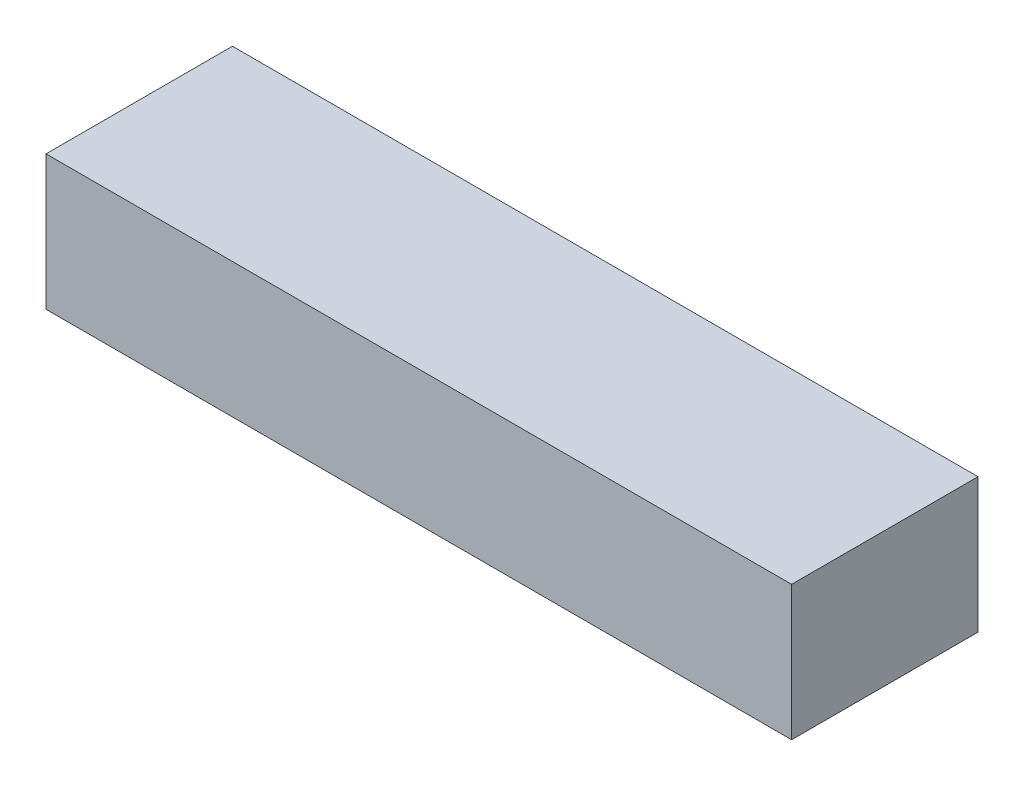
ISO-10303-21;
HEADER;
FILE_DESCRIPTION(('STEP AP214'),'2;1');
FILE_NAME('part.step','',(''),(''),'','','');
FILE_SCHEMA(('AUTOMOTIVE_DESIGN { 1 0 10303 214 1 1 1 1 }'));
ENDSEC;
DATA;
#1=APPLICATION_CONTEXT('core data for automotive mechanical design processes');
#2=APPLICATION_PROTOCOL_DEFINITION('international standard','automotive_design',2000,#1);
#3=PRODUCT_CONTEXT('',#1,'mechanical');
#4=PRODUCT('Part','Part','',(#3));
#5=PRODUCT_RELATED_PRODUCT_CATEGORY('part','',(#4));
#6=PRODUCT_DEFINITION_FORMATION('','',#4);
#7=PRODUCT_DEFINITION_CONTEXT('part definition',#1,'design');
#8=PRODUCT_DEFINITION('design','',#6,#7);
#9=PRODUCT_DEFINITION_SHAPE('','',#8);
#10=(LENGTH_UNIT() NAMED_UNIT(*) SI_UNIT(.MILLI.,.METRE.));
#11=(NAMED_UNIT(*) PLANE_ANGLE_UNIT() SI_UNIT($,.RADIAN.));
#12=(NAMED_UNIT(*) SI_UNIT($,.STERADIAN.) SOLID_ANGLE_UNIT());
#13=UNCERTAINTY_MEASURE_WITH_UNIT(LENGTH_MEASURE(1.E-05),#10,'distance_accuracy_value','');
#14=(GEOMETRIC_REPRESENTATION_CONTEXT(3) GLOBAL_UNCERTAINTY_ASSIGNED_CONTEXT((#13)) GLOBAL_UNIT_ASSIGNED_CONTEXT((#10,
#11,#12)) REPRESENTATION_CONTEXT('',''));
#15=CARTESIAN_POINT('',(0.,0.,0.));
#16=DIRECTION('',(0.,0.,1.));
#17=DIRECTION('',(1.,0.,0.));
#18=AXIS2_PLACEMENT_3D('',#15,#16,#17);
#19=CARTESIAN_POINT('',(54.,19.5,13.5));
#20=DIRECTION('',(-1.,0.,0.));
#21=DIRECTION('',(0.,0.,1.));
#22=AXIS2_PLACEMENT_3D('',#19,#20,#21);
#23=PLANE('',#22);
#24=DIRECTION('',(0.,0.,-1.));
#25=VECTOR('',#24,1.);
#26=CARTESIAN_POINT('',(54.,0.,13.5));
#27=LINE('',#26,#25);
#28=CARTESIAN_POINT('',(54.,0.,13.5));
#29=VERTEX_POINT('',#28);
#30=CARTESIAN_POINT('',(54.,0.,-13.5));
#31=VERTEX_POINT('',#30);
#32=EDGE_CURVE('E101',#29,#31,#27,.T.);
#33=ORIENTED_EDGE('',*,*,#32,.T.);
#34=DIRECTION('',(0.,-1.,0.));
#35=VECTOR('',#34,1.);
#36=CARTESIAN_POINT('',(54.,19.5,-13.5));
#37=LINE('',#36,#35);
#38=CARTESIAN_POINT('',(54.,19.5,-13.5));
#39=VERTEX_POINT('',#38);
#40=EDGE_CURVE('E11',#39,#31,#37,.T.);
#41=ORIENTED_EDGE('',*,*,#40,.F.);
#42=DIRECTION('',(0.,0.,-1.));
#43=VECTOR('',#42,1.);
#44=CARTESIAN_POINT('',(54.,19.5,13.5));
#45=LINE('',#44,#43);
#46=CARTESIAN_POINT('',(54.,19.5,13.5));
#47=VERTEX_POINT('',#46);
#48=EDGE_CURVE('E89',#47,#39,#45,.T.);
#49=ORIENTED_EDGE('',*,*,#48,.F.);
#50=DIRECTION('',(0.,-1.,0.));
#51=VECTOR('',#50,1.);
#52=CARTESIAN_POINT('',(54.,19.5,13.5));
#53=LINE('',#52,#51);
#54=EDGE_CURVE('E97',#47,#29,#53,.T.);
#55=ORIENTED_EDGE('',*,*,#54,.T.);
#56=EDGE_LOOP('',(#33,#41,#49,#55));
#57=FACE_BOUND('',#56,.T.);
#58=ADVANCED_FACE('F38',(#57),#23,.F.);
#59=CARTESIAN_POINT('',(-54.,19.5,-13.5));
#60=DIRECTION('',(0.,0.,1.));
#61=DIRECTION('',(1.,0.,0.));
#62=AXIS2_PLACEMENT_3D('',#59,#60,#61);
#63=PLANE('',#62);
#64=DIRECTION('',(-1.,0.,0.));
#65=VECTOR('',#64,1.);
#66=CARTESIAN_POINT('',(-54.,0.,-13.5));
#67=LINE('',#66,#65);
#68=CARTESIAN_POINT('',(-54.,0.,-13.5));
#69=VERTEX_POINT('',#68);
#70=EDGE_CURVE('E93',#31,#69,#67,.T.);
#71=ORIENTED_EDGE('',*,*,#70,.T.);
#72=DIRECTION('',(0.,-1.,0.));
#73=VECTOR('',#72,1.);
#74=CARTESIAN_POINT('',(-54.,19.5,-13.5));
#75=LINE('',#74,#73);
#76=CARTESIAN_POINT('',(-54.,19.5,-13.5));
#77=VERTEX_POINT('',#76);
#78=EDGE_CURVE('E46',#77,#69,#75,.T.);
#79=ORIENTED_EDGE('',*,*,#78,.F.);
#80=DIRECTION('',(-1.,0.,0.));
#81=VECTOR('',#80,1.);
#82=CARTESIAN_POINT('',(-54.,19.5,-13.5));
#83=LINE('',#82,#81);
#84=EDGE_CURVE('E84',#39,#77,#83,.T.);
#85=ORIENTED_EDGE('',*,*,#84,.F.);
#86=ORIENTED_EDGE('',*,*,#40,.T.);
#87=EDGE_LOOP('',(#71,#79,#85,#86));
#88=FACE_BOUND('',#87,.T.);
#89=ADVANCED_FACE('F92',(#88),#63,.F.);
#90=CARTESIAN_POINT('',(-54.,19.5,13.5));
#91=DIRECTION('',(1.,0.,0.));
#92=DIRECTION('',(0.,0.,-1.));
#93=AXIS2_PLACEMENT_3D('',#90,#91,#92);
#94=PLANE('',#93);
#95=DIRECTION('',(0.,0.,1.));
#96=VECTOR('',#95,1.);
#97=CARTESIAN_POINT('',(-54.,0.,13.5));
#98=LINE('',#97,#96);
#99=CARTESIAN_POINT('',(-54.,0.,13.5));
#100=VERTEX_POINT('',#99);
#101=EDGE_CURVE('E71',#69,#100,#98,.T.);
#102=ORIENTED_EDGE('',*,*,#101,.T.);
#103=DIRECTION('',(0.,-1.,0.));
#104=VECTOR('',#103,1.);
#105=CARTESIAN_POINT('',(-54.,19.5,13.5));
#106=LINE('',#105,#104);
#107=CARTESIAN_POINT('',(-54.,19.5,13.5));
#108=VERTEX_POINT('',#107);
#109=EDGE_CURVE('E94',#108,#100,#106,.T.);
#110=ORIENTED_EDGE('',*,*,#109,.F.);
#111=DIRECTION('',(0.,0.,1.));
#112=VECTOR('',#111,1.);
#113=CARTESIAN_POINT('',(-54.,19.5,13.5));
#114=LINE('',#113,#112);
#115=EDGE_CURVE('E87',#77,#108,#114,.T.);
#116=ORIENTED_EDGE('',*,*,#115,.F.);
#117=ORIENTED_EDGE('',*,*,#78,.T.);
#118=EDGE_LOOP('',(#102,#110,#116,#117));
#119=FACE_BOUND('',#118,.T.);
#120=ADVANCED_FACE('F95',(#119),#94,.F.);
#121=CARTESIAN_POINT('',(-54.,19.5,13.5));
#122=DIRECTION('',(0.,0.,-1.));
#123=DIRECTION('',(-1.,0.,0.));
#124=AXIS2_PLACEMENT_3D('',#121,#122,#123);
#125=PLANE('',#124);
#126=DIRECTION('',(1.,0.,0.));
#127=VECTOR('',#126,1.);
#128=CARTESIAN_POINT('',(-54.,0.,13.5));
#129=LINE('',#128,#127);
#130=EDGE_CURVE('E77',#100,#29,#129,.T.);
#131=ORIENTED_EDGE('',*,*,#130,.T.);
#132=ORIENTED_EDGE('',*,*,#54,.F.);
#133=DIRECTION('',(1.,0.,0.));
#134=VECTOR('',#133,1.);
#135=CARTESIAN_POINT('',(-54.,19.5,13.5));
#136=LINE('',#135,#134);
#137=EDGE_CURVE('E54',#108,#47,#136,.T.);
#138=ORIENTED_EDGE('',*,*,#137,.F.);
#139=ORIENTED_EDGE('',*,*,#109,.T.);
#140=EDGE_LOOP('',(#131,#132,#138,#139));
#141=FACE_BOUND('',#140,.T.);
#142=ADVANCED_FACE('F108',(#141),#125,.F.);
#143=CARTESIAN_POINT('',(0.,19.5,0.));
#144=DIRECTION('',(0.,-1.,0.));
#145=DIRECTION('',(0.,0.,-1.));
#146=AXIS2_PLACEMENT_3D('',#143,#144,#145);
#147=PLANE('',#146);
#148=ORIENTED_EDGE('',*,*,#48,.T.);
#149=ORIENTED_EDGE('',*,*,#84,.T.);
#150=ORIENTED_EDGE('',*,*,#115,.T.);
#151=ORIENTED_EDGE('',*,*,#137,.T.);
#152=EDGE_LOOP('',(#148,#149,#150,#151));
#153=FACE_BOUND('',#152,.T.);
#154=ADVANCED_FACE('F85',(#153),#147,.F.);
#155=CARTESIAN_POINT('',(0.,0.,0.));
#156=DIRECTION('',(0.,-1.,0.));
#157=DIRECTION('',(0.,0.,-1.));
#158=AXIS2_PLACEMENT_3D('',#155,#156,#157);
#159=PLANE('',#158);
#160=ORIENTED_EDGE('',*,*,#32,.F.);
#161=ORIENTED_EDGE('',*,*,#130,.F.);
#162=ORIENTED_EDGE('',*,*,#101,.F.);
#163=ORIENTED_EDGE('',*,*,#70,.F.);
#164=EDGE_LOOP('',(#160,#161,#162,#163));
#165=FACE_BOUND('',#164,.T.);
#166=ADVANCED_FACE('F111',(#165),#159,.T.);
#167=CLOSED_SHELL('',(#58,#89,#120,#142,#154,#166));
#168=MANIFOLD_SOLID_BREP('B2',#167);
#169=ADVANCED_BREP_SHAPE_REPRESENTATION('',(#18,#168),#14);
#170=SHAPE_DEFINITION_REPRESENTATION(#9,#169);
ENDSEC;
END-ISO-10303-21;
